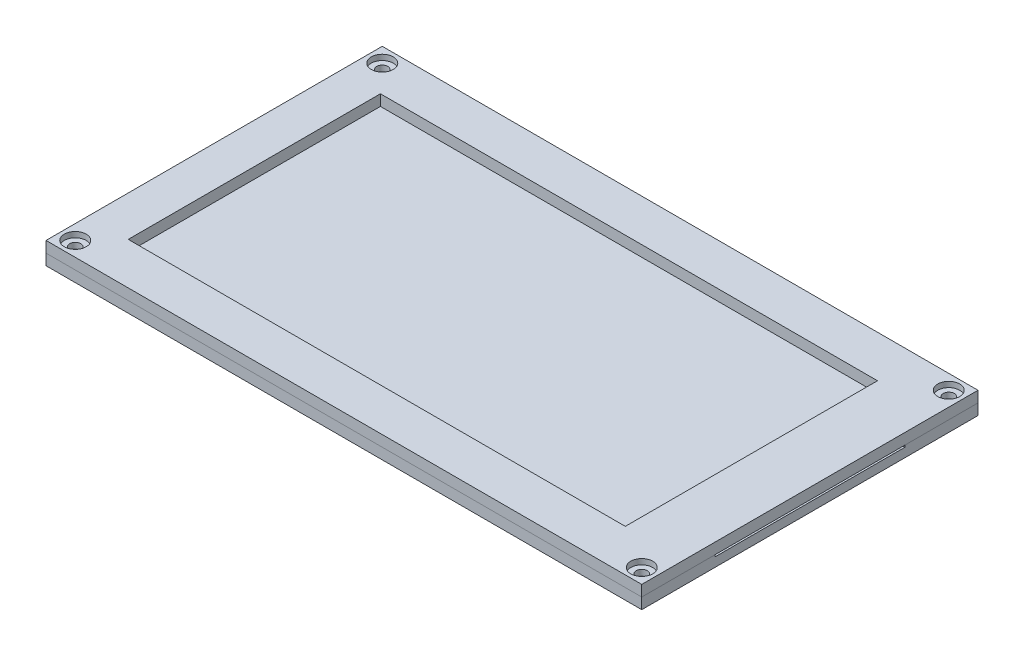
ISO-10303-21;
HEADER;
FILE_DESCRIPTION(('STEP AP214'),'2;1');
FILE_NAME('part.step','',(''),(''),'','','');
FILE_SCHEMA(('AUTOMOTIVE_DESIGN { 1 0 10303 214 1 1 1 1 }'));
ENDSEC;
DATA;
#1=APPLICATION_CONTEXT('core data for automotive mechanical design processes');
#2=APPLICATION_PROTOCOL_DEFINITION('international standard','automotive_design',2000,#1);
#3=PRODUCT_CONTEXT('',#1,'mechanical');
#4=PRODUCT('Part','Part','',(#3));
#5=PRODUCT_RELATED_PRODUCT_CATEGORY('part','',(#4));
#6=PRODUCT_DEFINITION_FORMATION('','',#4);
#7=PRODUCT_DEFINITION_CONTEXT('part definition',#1,'design');
#8=PRODUCT_DEFINITION('design','',#6,#7);
#9=PRODUCT_DEFINITION_SHAPE('','',#8);
#10=(LENGTH_UNIT() NAMED_UNIT(*) SI_UNIT(.MILLI.,.METRE.));
#11=(NAMED_UNIT(*) PLANE_ANGLE_UNIT() SI_UNIT($,.RADIAN.));
#12=(NAMED_UNIT(*) SI_UNIT($,.STERADIAN.) SOLID_ANGLE_UNIT());
#13=UNCERTAINTY_MEASURE_WITH_UNIT(LENGTH_MEASURE(1.E-05),#10,'distance_accuracy_value','');
#14=(GEOMETRIC_REPRESENTATION_CONTEXT(3) GLOBAL_UNCERTAINTY_ASSIGNED_CONTEXT((#13)) GLOBAL_UNIT_ASSIGNED_CONTEXT((#10,
#11,#12)) REPRESENTATION_CONTEXT('',''));
#15=CARTESIAN_POINT('',(0.,0.,0.));
#16=DIRECTION('',(0.,0.,1.));
#17=DIRECTION('',(1.,0.,0.));
#18=AXIS2_PLACEMENT_3D('',#15,#16,#17);
#19=CARTESIAN_POINT('',(0.,-0.5,-26.));
#20=DIRECTION('',(0.,0.,1.));
#21=DIRECTION('',(1.,0.,0.));
#22=AXIS2_PLACEMENT_3D('',#19,#20,#21);
#23=PLANE('',#22);
#24=DIRECTION('',(1.,0.,0.));
#25=VECTOR('',#24,1.);
#26=CARTESIAN_POINT('',(0.,0.,-26.));
#27=LINE('',#26,#25);
#28=CARTESIAN_POINT('',(76.4999999999999,0.,-26.));
#29=VERTEX_POINT('',#28);
#30=CARTESIAN_POINT('',(84.,0.,-26.));
#31=VERTEX_POINT('',#30);
#32=EDGE_CURVE('E172',#29,#31,#27,.T.);
#33=ORIENTED_EDGE('',*,*,#32,.F.);
#34=DIRECTION('',(0.,1.,0.));
#35=VECTOR('',#34,1.);
#36=CARTESIAN_POINT('',(76.4999999999999,-0.5,-26.));
#37=LINE('',#36,#35);
#38=CARTESIAN_POINT('',(76.4999999999999,-0.5,-26.));
#39=VERTEX_POINT('',#38);
#40=EDGE_CURVE('E12',#39,#29,#37,.T.);
#41=ORIENTED_EDGE('',*,*,#40,.F.);
#42=DIRECTION('',(1.,0.,0.));
#43=VECTOR('',#42,1.);
#44=CARTESIAN_POINT('',(0.,-0.5,-26.));
#45=LINE('',#44,#43);
#46=CARTESIAN_POINT('',(84.,-0.5,-26.));
#47=VERTEX_POINT('',#46);
#48=EDGE_CURVE('E223',#39,#47,#45,.T.);
#49=ORIENTED_EDGE('',*,*,#48,.T.);
#50=DIRECTION('',(0.,1.,0.));
#51=VECTOR('',#50,1.);
#52=CARTESIAN_POINT('',(84.,-0.5,-26.));
#53=LINE('',#52,#51);
#54=EDGE_CURVE('E68',#47,#31,#53,.T.);
#55=ORIENTED_EDGE('',*,*,#54,.T.);
#56=EDGE_LOOP('',(#33,#41,#49,#55));
#57=FACE_BOUND('',#56,.T.);
#58=ADVANCED_FACE('F51',(#57),#23,.T.);
#59=CARTESIAN_POINT('',(76.4999999999999,-0.5,0.));
#60=DIRECTION('',(-1.,0.,0.));
#61=DIRECTION('',(0.,0.,1.));
#62=AXIS2_PLACEMENT_3D('',#59,#60,#61);
#63=PLANE('',#62);
#64=DIRECTION('',(0.,0.,1.));
#65=VECTOR('',#64,1.);
#66=CARTESIAN_POINT('',(76.4999999999999,0.,0.));
#67=LINE('',#66,#65);
#68=CARTESIAN_POINT('',(76.4999999999999,0.,-38.5));
#69=VERTEX_POINT('',#68);
#70=EDGE_CURVE('E176',#69,#29,#67,.T.);
#71=ORIENTED_EDGE('',*,*,#70,.F.);
#72=DIRECTION('',(0.,1.,0.));
#73=VECTOR('',#72,1.);
#74=CARTESIAN_POINT('',(76.4999999999999,-0.5,-38.5));
#75=LINE('',#74,#73);
#76=CARTESIAN_POINT('',(76.4999999999999,-0.5,-38.5));
#77=VERTEX_POINT('',#76);
#78=EDGE_CURVE('E60',#77,#69,#75,.T.);
#79=ORIENTED_EDGE('',*,*,#78,.F.);
#80=DIRECTION('',(0.,0.,1.));
#81=VECTOR('',#80,1.);
#82=CARTESIAN_POINT('',(76.4999999999999,-0.5,0.));
#83=LINE('',#82,#81);
#84=EDGE_CURVE('E157',#77,#39,#83,.T.);
#85=ORIENTED_EDGE('',*,*,#84,.T.);
#86=ORIENTED_EDGE('',*,*,#40,.T.);
#87=EDGE_LOOP('',(#71,#79,#85,#86));
#88=FACE_BOUND('',#87,.T.);
#89=ADVANCED_FACE('F258',(#88),#63,.T.);
#90=CARTESIAN_POINT('',(0.,-0.5,-38.5));
#91=DIRECTION('',(0.,0.,1.));
#92=DIRECTION('',(1.,0.,0.));
#93=AXIS2_PLACEMENT_3D('',#90,#91,#92);
#94=PLANE('',#93);
#95=DIRECTION('',(1.,0.,0.));
#96=VECTOR('',#95,1.);
#97=CARTESIAN_POINT('',(0.,0.,-38.5));
#98=LINE('',#97,#96);
#99=CARTESIAN_POINT('',(-71.5,0.,-38.5));
#100=VERTEX_POINT('',#99);
#101=EDGE_CURVE('E181',#100,#69,#98,.T.);
#102=ORIENTED_EDGE('',*,*,#101,.F.);
#103=DIRECTION('',(0.,1.,0.));
#104=VECTOR('',#103,1.);
#105=CARTESIAN_POINT('',(-71.5,-0.5,-38.5));
#106=LINE('',#105,#104);
#107=CARTESIAN_POINT('',(-71.5,-0.5,-38.5));
#108=VERTEX_POINT('',#107);
#109=EDGE_CURVE('E248',#108,#100,#106,.T.);
#110=ORIENTED_EDGE('',*,*,#109,.F.);
#111=DIRECTION('',(1.,0.,0.));
#112=VECTOR('',#111,1.);
#113=CARTESIAN_POINT('',(0.,-0.5,-38.5));
#114=LINE('',#113,#112);
#115=EDGE_CURVE('E166',#108,#77,#114,.T.);
#116=ORIENTED_EDGE('',*,*,#115,.T.);
#117=ORIENTED_EDGE('',*,*,#78,.T.);
#118=EDGE_LOOP('',(#102,#110,#116,#117));
#119=FACE_BOUND('',#118,.T.);
#120=ADVANCED_FACE('F255',(#119),#94,.T.);
#121=CARTESIAN_POINT('',(-71.5,-0.5,0.));
#122=DIRECTION('',(1.,0.,0.));
#123=DIRECTION('',(0.,0.,-1.));
#124=AXIS2_PLACEMENT_3D('',#121,#122,#123);
#125=PLANE('',#124);
#126=DIRECTION('',(0.,0.,-1.));
#127=VECTOR('',#126,1.);
#128=CARTESIAN_POINT('',(-71.5,0.,0.));
#129=LINE('',#128,#127);
#130=CARTESIAN_POINT('',(-71.5,0.,38.5));
#131=VERTEX_POINT('',#130);
#132=EDGE_CURVE('E186',#131,#100,#129,.T.);
#133=ORIENTED_EDGE('',*,*,#132,.F.);
#134=DIRECTION('',(0.,1.,0.));
#135=VECTOR('',#134,1.);
#136=CARTESIAN_POINT('',(-71.5,-0.5,38.5));
#137=LINE('',#136,#135);
#138=CARTESIAN_POINT('',(-71.5,-0.5,38.5));
#139=VERTEX_POINT('',#138);
#140=EDGE_CURVE('E145',#139,#131,#137,.T.);
#141=ORIENTED_EDGE('',*,*,#140,.F.);
#142=DIRECTION('',(0.,0.,-1.));
#143=VECTOR('',#142,1.);
#144=CARTESIAN_POINT('',(-71.5,-0.5,0.));
#145=LINE('',#144,#143);
#146=EDGE_CURVE('E162',#139,#108,#145,.T.);
#147=ORIENTED_EDGE('',*,*,#146,.T.);
#148=ORIENTED_EDGE('',*,*,#109,.T.);
#149=EDGE_LOOP('',(#133,#141,#147,#148));
#150=FACE_BOUND('',#149,.T.);
#151=ADVANCED_FACE('F264',(#150),#125,.T.);
#152=CARTESIAN_POINT('',(0.,-0.5,38.5));
#153=DIRECTION('',(0.,0.,-1.));
#154=DIRECTION('',(-1.,0.,0.));
#155=AXIS2_PLACEMENT_3D('',#152,#153,#154);
#156=PLANE('',#155);
#157=DIRECTION('',(-1.,0.,0.));
#158=VECTOR('',#157,1.);
#159=CARTESIAN_POINT('',(0.,0.,38.5));
#160=LINE('',#159,#158);
#161=CARTESIAN_POINT('',(76.4999999999999,0.,38.5));
#162=VERTEX_POINT('',#161);
#163=EDGE_CURVE('E140',#162,#131,#160,.T.);
#164=ORIENTED_EDGE('',*,*,#163,.F.);
#165=DIRECTION('',(0.,1.,0.));
#166=VECTOR('',#165,1.);
#167=CARTESIAN_POINT('',(76.4999999999999,-0.5,38.5));
#168=LINE('',#167,#166);
#169=CARTESIAN_POINT('',(76.4999999999999,-0.5,38.5));
#170=VERTEX_POINT('',#169);
#171=EDGE_CURVE('E133',#170,#162,#168,.T.);
#172=ORIENTED_EDGE('',*,*,#171,.F.);
#173=DIRECTION('',(-1.,0.,0.));
#174=VECTOR('',#173,1.);
#175=CARTESIAN_POINT('',(0.,-0.5,38.5));
#176=LINE('',#175,#174);
#177=EDGE_CURVE('E137',#170,#139,#176,.T.);
#178=ORIENTED_EDGE('',*,*,#177,.T.);
#179=ORIENTED_EDGE('',*,*,#140,.T.);
#180=EDGE_LOOP('',(#164,#172,#178,#179));
#181=FACE_BOUND('',#180,.T.);
#182=ADVANCED_FACE('F135',(#181),#156,.T.);
#183=CARTESIAN_POINT('',(76.4999999999999,0.,26.));
#184=VERTEX_POINT('',#183);
#185=EDGE_CURVE('E182',#184,#162,#67,.T.);
#186=ORIENTED_EDGE('',*,*,#185,.F.);
#187=DIRECTION('',(0.,1.,0.));
#188=VECTOR('',#187,1.);
#189=CARTESIAN_POINT('',(76.4999999999999,-0.5,26.));
#190=LINE('',#189,#188);
#191=CARTESIAN_POINT('',(76.4999999999999,-0.5,26.));
#192=VERTEX_POINT('',#191);
#193=EDGE_CURVE('E146',#192,#184,#190,.T.);
#194=ORIENTED_EDGE('',*,*,#193,.F.);
#195=EDGE_CURVE('E149',#192,#170,#83,.T.);
#196=ORIENTED_EDGE('',*,*,#195,.T.);
#197=ORIENTED_EDGE('',*,*,#171,.T.);
#198=EDGE_LOOP('',(#186,#194,#196,#197));
#199=FACE_BOUND('',#198,.T.);
#200=ADVANCED_FACE('F150',(#199),#63,.T.);
#201=CARTESIAN_POINT('',(0.,-0.5,26.));
#202=DIRECTION('',(0.,0.,1.));
#203=DIRECTION('',(1.,0.,0.));
#204=AXIS2_PLACEMENT_3D('',#201,#202,#203);
#205=PLANE('',#204);
#206=DIRECTION('',(1.,0.,0.));
#207=VECTOR('',#206,1.);
#208=CARTESIAN_POINT('',(0.,0.,26.));
#209=LINE('',#208,#207);
#210=CARTESIAN_POINT('',(84.,0.,26.));
#211=VERTEX_POINT('',#210);
#212=EDGE_CURVE('E192',#184,#211,#209,.T.);
#213=ORIENTED_EDGE('',*,*,#212,.T.);
#214=DIRECTION('',(0.,1.,0.));
#215=VECTOR('',#214,1.);
#216=CARTESIAN_POINT('',(84.,-0.5,26.));
#217=LINE('',#216,#215);
#218=CARTESIAN_POINT('',(84.,-0.5,26.));
#219=VERTEX_POINT('',#218);
#220=EDGE_CURVE('E240',#219,#211,#217,.T.);
#221=ORIENTED_EDGE('',*,*,#220,.F.);
#222=DIRECTION('',(1.,0.,0.));
#223=VECTOR('',#222,1.);
#224=CARTESIAN_POINT('',(0.,-0.5,26.));
#225=LINE('',#224,#223);
#226=EDGE_CURVE('E155',#192,#219,#225,.T.);
#227=ORIENTED_EDGE('',*,*,#226,.F.);
#228=ORIENTED_EDGE('',*,*,#193,.T.);
#229=EDGE_LOOP('',(#213,#221,#227,#228));
#230=FACE_BOUND('',#229,.T.);
#231=ADVANCED_FACE('F334',(#230),#205,.F.);
#232=CARTESIAN_POINT('',(0.,-0.5,46.));
#233=DIRECTION('',(0.,0.,-1.));
#234=DIRECTION('',(-1.,0.,0.));
#235=AXIS2_PLACEMENT_3D('',#232,#233,#234);
#236=PLANE('',#235);
#237=DIRECTION('',(-1.,0.,0.));
#238=VECTOR('',#237,1.);
#239=CARTESIAN_POINT('',(0.,0.,46.));
#240=LINE('',#239,#238);
#241=CARTESIAN_POINT('',(84.,0.,46.));
#242=VERTEX_POINT('',#241);
#243=CARTESIAN_POINT('',(-79.,0.,46.));
#244=VERTEX_POINT('',#243);
#245=EDGE_CURVE('E198',#242,#244,#240,.T.);
#246=ORIENTED_EDGE('',*,*,#245,.T.);
#247=DIRECTION('',(0.,1.,0.));
#248=VECTOR('',#247,1.);
#249=CARTESIAN_POINT('',(-79.,-0.5,46.));
#250=LINE('',#249,#248);
#251=CARTESIAN_POINT('',(-79.,-3.,46.));
#252=VERTEX_POINT('',#251);
#253=EDGE_CURVE('E232',#252,#244,#250,.T.);
#254=ORIENTED_EDGE('',*,*,#253,.F.);
#255=DIRECTION('',(-1.,0.,0.));
#256=VECTOR('',#255,1.);
#257=CARTESIAN_POINT('',(84.,-3.,46.));
#258=LINE('',#257,#256);
#259=CARTESIAN_POINT('',(84.,-3.,46.));
#260=VERTEX_POINT('',#259);
#261=EDGE_CURVE('E273',#260,#252,#258,.T.);
#262=ORIENTED_EDGE('',*,*,#261,.F.);
#263=DIRECTION('',(0.,1.,0.));
#264=VECTOR('',#263,1.);
#265=CARTESIAN_POINT('',(84.,-0.5,46.));
#266=LINE('',#265,#264);
#267=EDGE_CURVE('E236',#260,#242,#266,.T.);
#268=ORIENTED_EDGE('',*,*,#267,.T.);
#269=EDGE_LOOP('',(#246,#254,#262,#268));
#270=FACE_BOUND('',#269,.T.);
#271=ADVANCED_FACE('F351',(#270),#236,.F.);
#272=CARTESIAN_POINT('',(-79.,-0.5,0.));
#273=DIRECTION('',(1.,0.,0.));
#274=DIRECTION('',(0.,0.,-1.));
#275=AXIS2_PLACEMENT_3D('',#272,#273,#274);
#276=PLANE('',#275);
#277=DIRECTION('',(0.,0.,-1.));
#278=VECTOR('',#277,1.);
#279=CARTESIAN_POINT('',(-79.,0.,0.));
#280=LINE('',#279,#278);
#281=CARTESIAN_POINT('',(-79.,0.,-46.));
#282=VERTEX_POINT('',#281);
#283=EDGE_CURVE('E202',#244,#282,#280,.T.);
#284=ORIENTED_EDGE('',*,*,#283,.T.);
#285=DIRECTION('',(0.,1.,0.));
#286=VECTOR('',#285,1.);
#287=CARTESIAN_POINT('',(-79.,-0.5,-46.));
#288=LINE('',#287,#286);
#289=CARTESIAN_POINT('',(-79.,-3.,-46.));
#290=VERTEX_POINT('',#289);
#291=EDGE_CURVE('E229',#290,#282,#288,.T.);
#292=ORIENTED_EDGE('',*,*,#291,.F.);
#293=DIRECTION('',(0.,0.,-1.));
#294=VECTOR('',#293,1.);
#295=CARTESIAN_POINT('',(-79.,-3.,46.));
#296=LINE('',#295,#294);
#297=EDGE_CURVE('E282',#252,#290,#296,.T.);
#298=ORIENTED_EDGE('',*,*,#297,.F.);
#299=ORIENTED_EDGE('',*,*,#253,.T.);
#300=EDGE_LOOP('',(#284,#292,#298,#299));
#301=FACE_BOUND('',#300,.T.);
#302=ADVANCED_FACE('F353',(#301),#276,.F.);
#303=CARTESIAN_POINT('',(0.,-0.5,-46.));
#304=DIRECTION('',(0.,0.,1.));
#305=DIRECTION('',(1.,0.,0.));
#306=AXIS2_PLACEMENT_3D('',#303,#304,#305);
#307=PLANE('',#306);
#308=DIRECTION('',(1.,0.,0.));
#309=VECTOR('',#308,1.);
#310=CARTESIAN_POINT('',(0.,0.,-46.));
#311=LINE('',#310,#309);
#312=CARTESIAN_POINT('',(84.,0.,-46.));
#313=VERTEX_POINT('',#312);
#314=EDGE_CURVE('E110',#282,#313,#311,.T.);
#315=ORIENTED_EDGE('',*,*,#314,.T.);
#316=DIRECTION('',(0.,1.,0.));
#317=VECTOR('',#316,1.);
#318=CARTESIAN_POINT('',(84.,-0.5,-46.));
#319=LINE('',#318,#317);
#320=CARTESIAN_POINT('',(84.,-3.,-46.));
#321=VERTEX_POINT('',#320);
#322=EDGE_CURVE('E226',#321,#313,#319,.T.);
#323=ORIENTED_EDGE('',*,*,#322,.F.);
#324=DIRECTION('',(1.,0.,0.));
#325=VECTOR('',#324,1.);
#326=CARTESIAN_POINT('',(-79.,-3.,-46.));
#327=LINE('',#326,#325);
#328=EDGE_CURVE('E278',#290,#321,#327,.T.);
#329=ORIENTED_EDGE('',*,*,#328,.F.);
#330=ORIENTED_EDGE('',*,*,#291,.T.);
#331=EDGE_LOOP('',(#315,#323,#329,#330));
#332=FACE_BOUND('',#331,.T.);
#333=ADVANCED_FACE('F357',(#332),#307,.F.);
#334=CARTESIAN_POINT('',(-75.,-0.5,42.));
#335=DIRECTION('',(0.,1.,0.));
#336=DIRECTION('',(0.,0.,1.));
#337=AXIS2_PLACEMENT_3D('',#334,#335,#336);
#338=CYLINDRICAL_SURFACE('',#337,1.5);
#339=CARTESIAN_POINT('',(-75.,0.,42.));
#340=DIRECTION('',(0.,-1.,0.));
#341=DIRECTION('',(0.,0.,-1.));
#342=AXIS2_PLACEMENT_3D('',#339,#340,#341);
#343=CIRCLE('',#342,1.5);
#344=CARTESIAN_POINT('',(-75.,0.,40.5));
#345=VERTEX_POINT('',#344);
#346=EDGE_CURVE('E215',#345,#345,#343,.F.);
#347=ORIENTED_EDGE('',*,*,#346,.T.);
#348=EDGE_LOOP('',(#347));
#349=FACE_BOUND('',#348,.T.);
#350=CARTESIAN_POINT('',(-75.,-3.,42.));
#351=DIRECTION('',(0.,-1.,0.));
#352=DIRECTION('',(0.,0.,-1.));
#353=AXIS2_PLACEMENT_3D('',#350,#351,#352);
#354=CIRCLE('',#353,1.5);
#355=CARTESIAN_POINT('',(-75.,-3.,40.5));
#356=VERTEX_POINT('',#355);
#357=EDGE_CURVE('E274',#356,#356,#354,.T.);
#358=ORIENTED_EDGE('',*,*,#357,.T.);
#359=EDGE_LOOP('',(#358));
#360=FACE_BOUND('',#359,.T.);
#361=ADVANCED_FACE('F359',(#349,#360),#338,.F.);
#362=CARTESIAN_POINT('',(80.,-0.5,42.));
#363=DIRECTION('',(0.,1.,0.));
#364=DIRECTION('',(0.,0.,1.));
#365=AXIS2_PLACEMENT_3D('',#362,#363,#364);
#366=CYLINDRICAL_SURFACE('',#365,1.5);
#367=CARTESIAN_POINT('',(80.,0.,42.));
#368=DIRECTION('',(0.,-1.,0.));
#369=DIRECTION('',(0.,0.,-1.));
#370=AXIS2_PLACEMENT_3D('',#367,#368,#369);
#371=CIRCLE('',#370,1.5);
#372=CARTESIAN_POINT('',(80.,0.,40.5));
#373=VERTEX_POINT('',#372);
#374=EDGE_CURVE('E211',#373,#373,#371,.F.);
#375=ORIENTED_EDGE('',*,*,#374,.T.);
#376=EDGE_LOOP('',(#375));
#377=FACE_BOUND('',#376,.T.);
#378=CARTESIAN_POINT('',(80.,-3.,42.));
#379=DIRECTION('',(0.,-1.,0.));
#380=DIRECTION('',(0.,0.,1.));
#381=AXIS2_PLACEMENT_3D('',#378,#379,#380);
#382=CIRCLE('',#381,1.5);
#383=CARTESIAN_POINT('',(80.,-3.,43.5));
#384=VERTEX_POINT('',#383);
#385=EDGE_CURVE('E292',#384,#384,#382,.T.);
#386=ORIENTED_EDGE('',*,*,#385,.T.);
#387=EDGE_LOOP('',(#386));
#388=FACE_BOUND('',#387,.T.);
#389=ADVANCED_FACE('F365',(#377,#388),#366,.F.);
#390=CARTESIAN_POINT('',(-75.,-0.5,-42.));
#391=DIRECTION('',(0.,1.,0.));
#392=DIRECTION('',(0.,0.,1.));
#393=AXIS2_PLACEMENT_3D('',#390,#391,#392);
#394=CYLINDRICAL_SURFACE('',#393,1.5);
#395=CARTESIAN_POINT('',(-75.,0.,-42.));
#396=DIRECTION('',(0.,-1.,0.));
#397=DIRECTION('',(0.,0.,-1.));
#398=AXIS2_PLACEMENT_3D('',#395,#396,#397);
#399=CIRCLE('',#398,1.5);
#400=CARTESIAN_POINT('',(-75.,0.,-43.5));
#401=VERTEX_POINT('',#400);
#402=EDGE_CURVE('E207',#401,#401,#399,.F.);
#403=ORIENTED_EDGE('',*,*,#402,.T.);
#404=EDGE_LOOP('',(#403));
#405=FACE_BOUND('',#404,.T.);
#406=CARTESIAN_POINT('',(-75.,-3.,-42.));
#407=DIRECTION('',(0.,-1.,0.));
#408=DIRECTION('',(0.,0.,1.));
#409=AXIS2_PLACEMENT_3D('',#406,#407,#408);
#410=CIRCLE('',#409,1.5);
#411=CARTESIAN_POINT('',(-75.,-3.,-40.5));
#412=VERTEX_POINT('',#411);
#413=EDGE_CURVE('E300',#412,#412,#410,.T.);
#414=ORIENTED_EDGE('',*,*,#413,.T.);
#415=EDGE_LOOP('',(#414));
#416=FACE_BOUND('',#415,.T.);
#417=ADVANCED_FACE('F305',(#405,#416),#394,.F.);
#418=CARTESIAN_POINT('',(84.,-0.5,0.));
#419=DIRECTION('',(-1.,0.,0.));
#420=DIRECTION('',(0.,0.,1.));
#421=AXIS2_PLACEMENT_3D('',#418,#419,#420);
#422=PLANE('',#421);
#423=DIRECTION('',(0.,0.,1.));
#424=VECTOR('',#423,1.);
#425=CARTESIAN_POINT('',(84.,0.,0.));
#426=LINE('',#425,#424);
#427=EDGE_CURVE('E199',#313,#31,#426,.T.);
#428=ORIENTED_EDGE('',*,*,#427,.T.);
#429=ORIENTED_EDGE('',*,*,#54,.F.);
#430=DIRECTION('',(0.,0.,1.));
#431=VECTOR('',#430,1.);
#432=CARTESIAN_POINT('',(84.,-0.5,-46.));
#433=LINE('',#432,#431);
#434=EDGE_CURVE('E270',#47,#219,#433,.T.);
#435=ORIENTED_EDGE('',*,*,#434,.T.);
#436=ORIENTED_EDGE('',*,*,#220,.T.);
#437=EDGE_CURVE('E195',#211,#242,#426,.T.);
#438=ORIENTED_EDGE('',*,*,#437,.T.);
#439=ORIENTED_EDGE('',*,*,#267,.F.);
#440=DIRECTION('',(0.,0.,1.));
#441=VECTOR('',#440,1.);
#442=CARTESIAN_POINT('',(84.,-3.,-46.));
#443=LINE('',#442,#441);
#444=EDGE_CURVE('E177',#321,#260,#443,.T.);
#445=ORIENTED_EDGE('',*,*,#444,.F.);
#446=ORIENTED_EDGE('',*,*,#322,.T.);
#447=EDGE_LOOP('',(#428,#429,#435,#436,#438,#439,#445,#446));
#448=FACE_BOUND('',#447,.T.);
#449=ADVANCED_FACE('F335',(#448),#422,.F.);
#450=CARTESIAN_POINT('',(80.,-0.5,-42.));
#451=DIRECTION('',(0.,1.,0.));
#452=DIRECTION('',(0.,0.,1.));
#453=AXIS2_PLACEMENT_3D('',#450,#451,#452);
#454=CYLINDRICAL_SURFACE('',#453,1.5);
#455=CARTESIAN_POINT('',(80.,0.,-42.));
#456=DIRECTION('',(0.,-1.,0.));
#457=DIRECTION('',(0.,0.,-1.));
#458=AXIS2_PLACEMENT_3D('',#455,#456,#457);
#459=CIRCLE('',#458,1.5);
#460=CARTESIAN_POINT('',(80.,0.,-43.5));
#461=VERTEX_POINT('',#460);
#462=EDGE_CURVE('E219',#461,#461,#459,.F.);
#463=ORIENTED_EDGE('',*,*,#462,.T.);
#464=EDGE_LOOP('',(#463));
#465=FACE_BOUND('',#464,.T.);
#466=CARTESIAN_POINT('',(80.,-3.,-42.));
#467=DIRECTION('',(0.,-1.,0.));
#468=DIRECTION('',(0.,0.,-1.));
#469=AXIS2_PLACEMENT_3D('',#466,#467,#468);
#470=CIRCLE('',#469,1.5);
#471=CARTESIAN_POINT('',(80.,-3.,-43.5));
#472=VERTEX_POINT('',#471);
#473=EDGE_CURVE('E296',#472,#472,#470,.T.);
#474=ORIENTED_EDGE('',*,*,#473,.T.);
#475=EDGE_LOOP('',(#474));
#476=FACE_BOUND('',#475,.T.);
#477=ADVANCED_FACE('F316',(#465,#476),#454,.F.);
#478=CARTESIAN_POINT('',(0.,0.,0.));
#479=DIRECTION('',(0.,-1.,0.));
#480=DIRECTION('',(0.,0.,-1.));
#481=AXIS2_PLACEMENT_3D('',#478,#479,#480);
#482=PLANE('',#481);
#483=ORIENTED_EDGE('',*,*,#32,.T.);
#484=ORIENTED_EDGE('',*,*,#427,.F.);
#485=ORIENTED_EDGE('',*,*,#314,.F.);
#486=ORIENTED_EDGE('',*,*,#283,.F.);
#487=ORIENTED_EDGE('',*,*,#245,.F.);
#488=ORIENTED_EDGE('',*,*,#437,.F.);
#489=ORIENTED_EDGE('',*,*,#212,.F.);
#490=ORIENTED_EDGE('',*,*,#185,.T.);
#491=ORIENTED_EDGE('',*,*,#163,.T.);
#492=ORIENTED_EDGE('',*,*,#132,.T.);
#493=ORIENTED_EDGE('',*,*,#101,.T.);
#494=ORIENTED_EDGE('',*,*,#70,.T.);
#495=EDGE_LOOP('',(#483,#484,#485,#486,#487,#488,#489,#490,#491,#492,#493,#494));
#496=FACE_BOUND('',#495,.T.);
#497=ORIENTED_EDGE('',*,*,#402,.F.);
#498=EDGE_LOOP('',(#497));
#499=FACE_BOUND('',#498,.T.);
#500=ORIENTED_EDGE('',*,*,#374,.F.);
#501=EDGE_LOOP('',(#500));
#502=FACE_BOUND('',#501,.T.);
#503=ORIENTED_EDGE('',*,*,#346,.F.);
#504=EDGE_LOOP('',(#503));
#505=FACE_BOUND('',#504,.T.);
#506=ORIENTED_EDGE('',*,*,#462,.F.);
#507=EDGE_LOOP('',(#506));
#508=FACE_BOUND('',#507,.T.);
#509=ADVANCED_FACE('F260',(#496,#499,#502,#505,#508),#482,.F.);
#510=CARTESIAN_POINT('',(0.,-3.,0.));
#511=DIRECTION('',(0.,-1.,0.));
#512=DIRECTION('',(0.,0.,-1.));
#513=AXIS2_PLACEMENT_3D('',#510,#511,#512);
#514=PLANE('',#513);
#515=ORIENTED_EDGE('',*,*,#473,.F.);
#516=EDGE_LOOP('',(#515));
#517=FACE_BOUND('',#516,.T.);
#518=ORIENTED_EDGE('',*,*,#357,.F.);
#519=EDGE_LOOP('',(#518));
#520=FACE_BOUND('',#519,.T.);
#521=ORIENTED_EDGE('',*,*,#261,.T.);
#522=ORIENTED_EDGE('',*,*,#297,.T.);
#523=ORIENTED_EDGE('',*,*,#328,.T.);
#524=ORIENTED_EDGE('',*,*,#444,.T.);
#525=EDGE_LOOP('',(#521,#522,#523,#524));
#526=FACE_BOUND('',#525,.T.);
#527=ORIENTED_EDGE('',*,*,#385,.F.);
#528=EDGE_LOOP('',(#527));
#529=FACE_BOUND('',#528,.T.);
#530=ORIENTED_EDGE('',*,*,#413,.F.);
#531=EDGE_LOOP('',(#530));
#532=FACE_BOUND('',#531,.T.);
#533=ADVANCED_FACE('F307',(#517,#520,#526,#529,#532),#514,.T.);
#534=CARTESIAN_POINT('',(0.,-0.5,0.));
#535=DIRECTION('',(0.,-1.,0.));
#536=DIRECTION('',(0.,0.,-1.));
#537=AXIS2_PLACEMENT_3D('',#534,#535,#536);
#538=PLANE('',#537);
#539=ORIENTED_EDGE('',*,*,#48,.F.);
#540=ORIENTED_EDGE('',*,*,#84,.F.);
#541=ORIENTED_EDGE('',*,*,#115,.F.);
#542=ORIENTED_EDGE('',*,*,#146,.F.);
#543=ORIENTED_EDGE('',*,*,#177,.F.);
#544=ORIENTED_EDGE('',*,*,#195,.F.);
#545=ORIENTED_EDGE('',*,*,#226,.T.);
#546=ORIENTED_EDGE('',*,*,#434,.F.);
#547=EDGE_LOOP('',(#539,#540,#541,#542,#543,#544,#545,#546));
#548=FACE_BOUND('',#547,.T.);
#549=ADVANCED_FACE('F159',(#548),#538,.F.);
#550=CLOSED_SHELL('',(#58,#89,#120,#151,#182,#200,#231,#271,#302,#333,#361,#389,#417,#449,#477,
#509,#533,#549));
#551=MANIFOLD_SOLID_BREP('B2',#550);
#552=CARTESIAN_POINT('',(-75.,3.,-42.));
#553=DIRECTION('',(0.,-1.,0.));
#554=DIRECTION('',(0.,0.,-1.));
#555=AXIS2_PLACEMENT_3D('',#552,#553,#554);
#556=CYLINDRICAL_SURFACE('',#555,1.5);
#557=CARTESIAN_POINT('',(-75.,0.,-42.));
#558=DIRECTION('',(0.,1.,0.));
#559=DIRECTION('',(0.,0.,1.));
#560=AXIS2_PLACEMENT_3D('',#557,#558,#559);
#561=CIRCLE('',#560,1.5);
#562=CARTESIAN_POINT('',(-75.,0.,-40.5));
#563=VERTEX_POINT('',#562);
#564=EDGE_CURVE('E657',#563,#563,#561,.T.);
#565=ORIENTED_EDGE('',*,*,#564,.F.);
#566=EDGE_LOOP('',(#565));
#567=FACE_BOUND('',#566,.T.);
#568=CARTESIAN_POINT('',(-75.,1.5,-42.));
#569=DIRECTION('',(0.,1.,0.));
#570=DIRECTION('',(0.,0.,1.));
#571=AXIS2_PLACEMENT_3D('',#568,#569,#570);
#572=CIRCLE('',#571,1.5);
#573=CARTESIAN_POINT('',(-75.,1.5,-40.5));
#574=VERTEX_POINT('',#573);
#575=EDGE_CURVE('E565',#574,#574,#572,.T.);
#576=ORIENTED_EDGE('',*,*,#575,.T.);
#577=EDGE_LOOP('',(#576));
#578=FACE_BOUND('',#577,.T.);
#579=ADVANCED_FACE('F561',(#567,#578),#556,.F.);
#580=CARTESIAN_POINT('',(80.,3.,42.));
#581=DIRECTION('',(0.,-1.,0.));
#582=DIRECTION('',(0.,0.,-1.));
#583=AXIS2_PLACEMENT_3D('',#580,#581,#582);
#584=CYLINDRICAL_SURFACE('',#583,1.5);
#585=CARTESIAN_POINT('',(80.,0.,42.));
#586=DIRECTION('',(0.,1.,0.));
#587=DIRECTION('',(0.,0.,1.));
#588=AXIS2_PLACEMENT_3D('',#585,#586,#587);
#589=CIRCLE('',#588,1.5);
#590=CARTESIAN_POINT('',(80.,0.,43.5));
#591=VERTEX_POINT('',#590);
#592=EDGE_CURVE('E707',#591,#591,#589,.T.);
#593=ORIENTED_EDGE('',*,*,#592,.F.);
#594=EDGE_LOOP('',(#593));
#595=FACE_BOUND('',#594,.T.);
#596=CARTESIAN_POINT('',(80.,1.5,42.));
#597=DIRECTION('',(0.,1.,0.));
#598=DIRECTION('',(0.,0.,1.));
#599=AXIS2_PLACEMENT_3D('',#596,#597,#598);
#600=CIRCLE('',#599,1.5);
#601=CARTESIAN_POINT('',(80.,1.5,43.5));
#602=VERTEX_POINT('',#601);
#603=EDGE_CURVE('E695',#602,#602,#600,.T.);
#604=ORIENTED_EDGE('',*,*,#603,.T.);
#605=EDGE_LOOP('',(#604));
#606=FACE_BOUND('',#605,.T.);
#607=ADVANCED_FACE('F726',(#595,#606),#584,.F.);
#608=CARTESIAN_POINT('',(0.,3.,0.));
#609=DIRECTION('',(0.,1.,0.));
#610=DIRECTION('',(0.,0.,1.));
#611=AXIS2_PLACEMENT_3D('',#608,#609,#610);
#612=PLANE('',#611);
#613=CARTESIAN_POINT('',(-75.,3.,42.));
#614=DIRECTION('',(0.,1.,0.));
#615=DIRECTION('',(0.,0.,-1.));
#616=AXIS2_PLACEMENT_3D('',#613,#614,#615);
#617=CIRCLE('',#616,3.00000000000001);
#618=CARTESIAN_POINT('',(-75.,3.,39.));
#619=VERTEX_POINT('',#618);
#620=EDGE_CURVE('E947',#619,#619,#617,.T.);
#621=ORIENTED_EDGE('',*,*,#620,.F.);
#622=EDGE_LOOP('',(#621));
#623=FACE_BOUND('',#622,.T.);
#624=CARTESIAN_POINT('',(80.,3.,42.));
#625=DIRECTION('',(0.,1.,0.));
#626=DIRECTION('',(0.,0.,1.));
#627=AXIS2_PLACEMENT_3D('',#624,#625,#626);
#628=CIRCLE('',#627,3.00000000000001);
#629=CARTESIAN_POINT('',(80.,3.,45.));
#630=VERTEX_POINT('',#629);
#631=EDGE_CURVE('E953',#630,#630,#628,.T.);
#632=ORIENTED_EDGE('',*,*,#631,.F.);
#633=EDGE_LOOP('',(#632));
#634=FACE_BOUND('',#633,.T.);
#635=CARTESIAN_POINT('',(80.,3.,-42.));
#636=DIRECTION('',(0.,1.,0.));
#637=DIRECTION('',(0.,0.,-1.));
#638=AXIS2_PLACEMENT_3D('',#635,#636,#637);
#639=CIRCLE('',#638,3.00000000000001);
#640=CARTESIAN_POINT('',(80.,3.,-45.));
#641=VERTEX_POINT('',#640);
#642=EDGE_CURVE('E959',#641,#641,#639,.T.);
#643=ORIENTED_EDGE('',*,*,#642,.F.);
#644=EDGE_LOOP('',(#643));
#645=FACE_BOUND('',#644,.T.);
#646=CARTESIAN_POINT('',(-75.,3.,-42.));
#647=DIRECTION('',(0.,1.,0.));
#648=DIRECTION('',(0.,0.,1.));
#649=AXIS2_PLACEMENT_3D('',#646,#647,#648);
#650=CIRCLE('',#649,3.00000000000001);
#651=CARTESIAN_POINT('',(-75.,3.,-39.));
#652=VERTEX_POINT('',#651);
#653=EDGE_CURVE('E715',#652,#652,#650,.T.);
#654=ORIENTED_EDGE('',*,*,#653,.F.);
#655=EDGE_LOOP('',(#654));
#656=FACE_BOUND('',#655,.T.);
#657=DIRECTION('',(-1.,0.,0.));
#658=VECTOR('',#657,1.);
#659=CARTESIAN_POINT('',(83.9999999999999,3.,-46.));
#660=LINE('',#659,#658);
#661=CARTESIAN_POINT('',(83.9999999999999,3.,-46.));
#662=VERTEX_POINT('',#661);
#663=CARTESIAN_POINT('',(-79.,3.,-46.));
#664=VERTEX_POINT('',#663);
#665=EDGE_CURVE('E667',#662,#664,#660,.T.);
#666=ORIENTED_EDGE('',*,*,#665,.T.);
#667=DIRECTION('',(0.,0.,1.));
#668=VECTOR('',#667,1.);
#669=CARTESIAN_POINT('',(-79.,3.,-46.));
#670=LINE('',#669,#668);
#671=CARTESIAN_POINT('',(-79.,3.,46.));
#672=VERTEX_POINT('',#671);
#673=EDGE_CURVE('E670',#664,#672,#670,.T.);
#674=ORIENTED_EDGE('',*,*,#673,.T.);
#675=DIRECTION('',(1.,0.,0.));
#676=VECTOR('',#675,1.);
#677=CARTESIAN_POINT('',(-79.,3.,46.));
#678=LINE('',#677,#676);
#679=CARTESIAN_POINT('',(84.,3.,46.));
#680=VERTEX_POINT('',#679);
#681=EDGE_CURVE('E673',#672,#680,#678,.T.);
#682=ORIENTED_EDGE('',*,*,#681,.T.);
#683=DIRECTION('',(0.,0.,-1.));
#684=VECTOR('',#683,1.);
#685=CARTESIAN_POINT('',(84.,3.,46.));
#686=LINE('',#685,#684);
#687=EDGE_CURVE('E675',#680,#662,#686,.T.);
#688=ORIENTED_EDGE('',*,*,#687,.T.);
#689=EDGE_LOOP('',(#666,#674,#682,#688));
#690=FACE_BOUND('',#689,.T.);
#691=DIRECTION('',(-1.,0.,0.));
#692=VECTOR('',#691,1.);
#693=CARTESIAN_POINT('',(-68.,3.,-34.5));
#694=LINE('',#693,#692);
#695=CARTESIAN_POINT('',(68.,3.,-34.5));
#696=VERTEX_POINT('',#695);
#697=CARTESIAN_POINT('',(-68.,3.,-34.5));
#698=VERTEX_POINT('',#697);
#699=EDGE_CURVE('E636',#696,#698,#694,.T.);
#700=ORIENTED_EDGE('',*,*,#699,.F.);
#701=DIRECTION('',(0.,0.,-1.));
#702=VECTOR('',#701,1.);
#703=CARTESIAN_POINT('',(68.,3.,-34.5));
#704=LINE('',#703,#702);
#705=CARTESIAN_POINT('',(68.,3.,34.5));
#706=VERTEX_POINT('',#705);
#707=EDGE_CURVE('E628',#706,#696,#704,.T.);
#708=ORIENTED_EDGE('',*,*,#707,.F.);
#709=DIRECTION('',(1.,0.,0.));
#710=VECTOR('',#709,1.);
#711=CARTESIAN_POINT('',(-68.,3.,34.5));
#712=LINE('',#711,#710);
#713=CARTESIAN_POINT('',(-68.,3.,34.5));
#714=VERTEX_POINT('',#713);
#715=EDGE_CURVE('E651',#714,#706,#712,.T.);
#716=ORIENTED_EDGE('',*,*,#715,.F.);
#717=DIRECTION('',(0.,0.,1.));
#718=VECTOR('',#717,1.);
#719=CARTESIAN_POINT('',(-68.,3.,-34.5));
#720=LINE('',#719,#718);
#721=EDGE_CURVE('E649',#698,#714,#720,.T.);
#722=ORIENTED_EDGE('',*,*,#721,.F.);
#723=EDGE_LOOP('',(#700,#708,#716,#722));
#724=FACE_BOUND('',#723,.T.);
#725=ADVANCED_FACE('F648',(#623,#634,#645,#656,#690,#724),#612,.T.);
#726=CARTESIAN_POINT('',(0.,0.,0.));
#727=DIRECTION('',(0.,1.,0.));
#728=DIRECTION('',(0.,0.,1.));
#729=AXIS2_PLACEMENT_3D('',#726,#727,#728);
#730=PLANE('',#729);
#731=DIRECTION('',(-1.,0.,0.));
#732=VECTOR('',#731,1.);
#733=CARTESIAN_POINT('',(83.9999999999999,0.,-46.));
#734=LINE('',#733,#732);
#735=CARTESIAN_POINT('',(83.9999999999999,0.,-46.));
#736=VERTEX_POINT('',#735);
#737=CARTESIAN_POINT('',(-79.,0.,-46.));
#738=VERTEX_POINT('',#737);
#739=EDGE_CURVE('E644',#736,#738,#734,.T.);
#740=ORIENTED_EDGE('',*,*,#739,.F.);
#741=DIRECTION('',(0.,0.,-1.));
#742=VECTOR('',#741,1.);
#743=CARTESIAN_POINT('',(84.,0.,46.));
#744=LINE('',#743,#742);
#745=CARTESIAN_POINT('',(84.,0.,46.));
#746=VERTEX_POINT('',#745);
#747=EDGE_CURVE('E671',#746,#736,#744,.T.);
#748=ORIENTED_EDGE('',*,*,#747,.F.);
#749=DIRECTION('',(1.,0.,0.));
#750=VECTOR('',#749,1.);
#751=CARTESIAN_POINT('',(-79.,0.,46.));
#752=LINE('',#751,#750);
#753=CARTESIAN_POINT('',(-79.,0.,46.));
#754=VERTEX_POINT('',#753);
#755=EDGE_CURVE('E682',#754,#746,#752,.T.);
#756=ORIENTED_EDGE('',*,*,#755,.F.);
#757=DIRECTION('',(0.,0.,1.));
#758=VECTOR('',#757,1.);
#759=CARTESIAN_POINT('',(-79.,0.,-46.));
#760=LINE('',#759,#758);
#761=EDGE_CURVE('E680',#738,#754,#760,.T.);
#762=ORIENTED_EDGE('',*,*,#761,.F.);
#763=EDGE_LOOP('',(#740,#748,#756,#762));
#764=FACE_BOUND('',#763,.T.);
#765=DIRECTION('',(0.,0.,-1.));
#766=VECTOR('',#765,1.);
#767=CARTESIAN_POINT('',(68.,0.,-34.5));
#768=LINE('',#767,#766);
#769=CARTESIAN_POINT('',(68.,0.,34.5));
#770=VERTEX_POINT('',#769);
#771=CARTESIAN_POINT('',(68.,0.,-34.5));
#772=VERTEX_POINT('',#771);
#773=EDGE_CURVE('E586',#770,#772,#768,.T.);
#774=ORIENTED_EDGE('',*,*,#773,.T.);
#775=DIRECTION('',(-1.,0.,0.));
#776=VECTOR('',#775,1.);
#777=CARTESIAN_POINT('',(-68.,0.,-34.5));
#778=LINE('',#777,#776);
#779=CARTESIAN_POINT('',(-68.,0.,-34.5));
#780=VERTEX_POINT('',#779);
#781=EDGE_CURVE('E643',#772,#780,#778,.T.);
#782=ORIENTED_EDGE('',*,*,#781,.T.);
#783=DIRECTION('',(0.,0.,1.));
#784=VECTOR('',#783,1.);
#785=CARTESIAN_POINT('',(-68.,0.,-34.5));
#786=LINE('',#785,#784);
#787=CARTESIAN_POINT('',(-68.,0.,34.5));
#788=VERTEX_POINT('',#787);
#789=EDGE_CURVE('E659',#780,#788,#786,.T.);
#790=ORIENTED_EDGE('',*,*,#789,.T.);
#791=DIRECTION('',(1.,0.,0.));
#792=VECTOR('',#791,1.);
#793=CARTESIAN_POINT('',(-68.,0.,34.5));
#794=LINE('',#793,#792);
#795=EDGE_CURVE('E637',#788,#770,#794,.T.);
#796=ORIENTED_EDGE('',*,*,#795,.T.);
#797=EDGE_LOOP('',(#774,#782,#790,#796));
#798=FACE_BOUND('',#797,.T.);
#799=ORIENTED_EDGE('',*,*,#564,.T.);
#800=EDGE_LOOP('',(#799));
#801=FACE_BOUND('',#800,.T.);
#802=CARTESIAN_POINT('',(80.,0.,-42.));
#803=DIRECTION('',(0.,1.,0.));
#804=DIRECTION('',(0.,0.,-1.));
#805=AXIS2_PLACEMENT_3D('',#802,#803,#804);
#806=CIRCLE('',#805,1.5);
#807=CARTESIAN_POINT('',(80.,0.,-43.5));
#808=VERTEX_POINT('',#807);
#809=EDGE_CURVE('E712',#808,#808,#806,.T.);
#810=ORIENTED_EDGE('',*,*,#809,.T.);
#811=EDGE_LOOP('',(#810));
#812=FACE_BOUND('',#811,.T.);
#813=ORIENTED_EDGE('',*,*,#592,.T.);
#814=EDGE_LOOP('',(#813));
#815=FACE_BOUND('',#814,.T.);
#816=CARTESIAN_POINT('',(-75.,0.,42.));
#817=DIRECTION('',(0.,1.,0.));
#818=DIRECTION('',(0.,0.,-1.));
#819=AXIS2_PLACEMENT_3D('',#816,#817,#818);
#820=CIRCLE('',#819,1.5);
#821=CARTESIAN_POINT('',(-75.,0.,40.5));
#822=VERTEX_POINT('',#821);
#823=EDGE_CURVE('E703',#822,#822,#820,.T.);
#824=ORIENTED_EDGE('',*,*,#823,.T.);
#825=EDGE_LOOP('',(#824));
#826=FACE_BOUND('',#825,.T.);
#827=ADVANCED_FACE('F722',(#764,#798,#801,#812,#815,#826),#730,.F.);
#828=CARTESIAN_POINT('',(83.9999999999999,3.,-46.));
#829=DIRECTION('',(0.,0.,1.));
#830=DIRECTION('',(1.,0.,0.));
#831=AXIS2_PLACEMENT_3D('',#828,#829,#830);
#832=PLANE('',#831);
#833=ORIENTED_EDGE('',*,*,#739,.T.);
#834=DIRECTION('',(0.,-1.,0.));
#835=VECTOR('',#834,1.);
#836=CARTESIAN_POINT('',(-79.,3.,-46.));
#837=LINE('',#836,#835);
#838=EDGE_CURVE('E49',#664,#738,#837,.T.);
#839=ORIENTED_EDGE('',*,*,#838,.F.);
#840=ORIENTED_EDGE('',*,*,#665,.F.);
#841=DIRECTION('',(0.,-1.,0.));
#842=VECTOR('',#841,1.);
#843=CARTESIAN_POINT('',(83.9999999999999,3.,-46.));
#844=LINE('',#843,#842);
#845=EDGE_CURVE('E677',#662,#736,#844,.T.);
#846=ORIENTED_EDGE('',*,*,#845,.T.);
#847=EDGE_LOOP('',(#833,#839,#840,#846));
#848=FACE_BOUND('',#847,.T.);
#849=ADVANCED_FACE('F563',(#848),#832,.F.);
#850=CARTESIAN_POINT('',(-79.,3.,-46.));
#851=DIRECTION('',(1.,0.,0.));
#852=DIRECTION('',(0.,0.,-1.));
#853=AXIS2_PLACEMENT_3D('',#850,#851,#852);
#854=PLANE('',#853);
#855=ORIENTED_EDGE('',*,*,#761,.T.);
#856=DIRECTION('',(0.,-1.,0.));
#857=VECTOR('',#856,1.);
#858=CARTESIAN_POINT('',(-79.,3.,46.));
#859=LINE('',#858,#857);
#860=EDGE_CURVE('E570',#672,#754,#859,.T.);
#861=ORIENTED_EDGE('',*,*,#860,.F.);
#862=ORIENTED_EDGE('',*,*,#673,.F.);
#863=ORIENTED_EDGE('',*,*,#838,.T.);
#864=EDGE_LOOP('',(#855,#861,#862,#863));
#865=FACE_BOUND('',#864,.T.);
#866=ADVANCED_FACE('F759',(#865),#854,.F.);
#867=CARTESIAN_POINT('',(-79.,3.,46.));
#868=DIRECTION('',(0.,0.,-1.));
#869=DIRECTION('',(-1.,0.,0.));
#870=AXIS2_PLACEMENT_3D('',#867,#868,#869);
#871=PLANE('',#870);
#872=ORIENTED_EDGE('',*,*,#755,.T.);
#873=DIRECTION('',(0.,-1.,0.));
#874=VECTOR('',#873,1.);
#875=CARTESIAN_POINT('',(84.,3.,46.));
#876=LINE('',#875,#874);
#877=EDGE_CURVE('E687',#680,#746,#876,.T.);
#878=ORIENTED_EDGE('',*,*,#877,.F.);
#879=ORIENTED_EDGE('',*,*,#681,.F.);
#880=ORIENTED_EDGE('',*,*,#860,.T.);
#881=EDGE_LOOP('',(#872,#878,#879,#880));
#882=FACE_BOUND('',#881,.T.);
#883=ADVANCED_FACE('F756',(#882),#871,.F.);
#884=CARTESIAN_POINT('',(84.,3.,46.));
#885=DIRECTION('',(-1.,0.,0.));
#886=DIRECTION('',(0.,0.,1.));
#887=AXIS2_PLACEMENT_3D('',#884,#885,#886);
#888=PLANE('',#887);
#889=ORIENTED_EDGE('',*,*,#747,.T.);
#890=ORIENTED_EDGE('',*,*,#845,.F.);
#891=ORIENTED_EDGE('',*,*,#687,.F.);
#892=ORIENTED_EDGE('',*,*,#877,.T.);
#893=EDGE_LOOP('',(#889,#890,#891,#892));
#894=FACE_BOUND('',#893,.T.);
#895=ADVANCED_FACE('F747',(#894),#888,.F.);
#896=CARTESIAN_POINT('',(68.,3.,-34.5));
#897=DIRECTION('',(-1.,0.,0.));
#898=DIRECTION('',(0.,0.,1.));
#899=AXIS2_PLACEMENT_3D('',#896,#897,#898);
#900=PLANE('',#899);
#901=ORIENTED_EDGE('',*,*,#773,.F.);
#902=DIRECTION('',(0.,-1.,0.));
#903=VECTOR('',#902,1.);
#904=CARTESIAN_POINT('',(68.,3.,34.5));
#905=LINE('',#904,#903);
#906=EDGE_CURVE('E632',#706,#770,#905,.T.);
#907=ORIENTED_EDGE('',*,*,#906,.F.);
#908=ORIENTED_EDGE('',*,*,#707,.T.);
#909=DIRECTION('',(0.,-1.,0.));
#910=VECTOR('',#909,1.);
#911=CARTESIAN_POINT('',(68.,3.,-34.5));
#912=LINE('',#911,#910);
#913=EDGE_CURVE('E631',#696,#772,#912,.T.);
#914=ORIENTED_EDGE('',*,*,#913,.T.);
#915=EDGE_LOOP('',(#901,#907,#908,#914));
#916=FACE_BOUND('',#915,.T.);
#917=ADVANCED_FACE('F630',(#916),#900,.T.);
#918=CARTESIAN_POINT('',(-68.,3.,-34.5));
#919=DIRECTION('',(0.,0.,1.));
#920=DIRECTION('',(1.,0.,0.));
#921=AXIS2_PLACEMENT_3D('',#918,#919,#920);
#922=PLANE('',#921);
#923=ORIENTED_EDGE('',*,*,#781,.F.);
#924=ORIENTED_EDGE('',*,*,#913,.F.);
#925=ORIENTED_EDGE('',*,*,#699,.T.);
#926=DIRECTION('',(0.,-1.,0.));
#927=VECTOR('',#926,1.);
#928=CARTESIAN_POINT('',(-68.,3.,-34.5));
#929=LINE('',#928,#927);
#930=EDGE_CURVE('E645',#698,#780,#929,.T.);
#931=ORIENTED_EDGE('',*,*,#930,.T.);
#932=EDGE_LOOP('',(#923,#924,#925,#931));
#933=FACE_BOUND('',#932,.T.);
#934=ADVANCED_FACE('F640',(#933),#922,.T.);
#935=CARTESIAN_POINT('',(-68.,3.,-34.5));
#936=DIRECTION('',(1.,0.,0.));
#937=DIRECTION('',(0.,0.,-1.));
#938=AXIS2_PLACEMENT_3D('',#935,#936,#937);
#939=PLANE('',#938);
#940=ORIENTED_EDGE('',*,*,#789,.F.);
#941=ORIENTED_EDGE('',*,*,#930,.F.);
#942=ORIENTED_EDGE('',*,*,#721,.T.);
#943=DIRECTION('',(0.,-1.,0.));
#944=VECTOR('',#943,1.);
#945=CARTESIAN_POINT('',(-68.,3.,34.5));
#946=LINE('',#945,#944);
#947=EDGE_CURVE('E578',#714,#788,#946,.T.);
#948=ORIENTED_EDGE('',*,*,#947,.T.);
#949=EDGE_LOOP('',(#940,#941,#942,#948));
#950=FACE_BOUND('',#949,.T.);
#951=ADVANCED_FACE('F739',(#950),#939,.T.);
#952=CARTESIAN_POINT('',(-68.,3.,34.5));
#953=DIRECTION('',(0.,0.,-1.));
#954=DIRECTION('',(-1.,0.,0.));
#955=AXIS2_PLACEMENT_3D('',#952,#953,#954);
#956=PLANE('',#955);
#957=ORIENTED_EDGE('',*,*,#795,.F.);
#958=ORIENTED_EDGE('',*,*,#947,.F.);
#959=ORIENTED_EDGE('',*,*,#715,.T.);
#960=ORIENTED_EDGE('',*,*,#906,.T.);
#961=EDGE_LOOP('',(#957,#958,#959,#960));
#962=FACE_BOUND('',#961,.T.);
#963=ADVANCED_FACE('F736',(#962),#956,.T.);
#964=CARTESIAN_POINT('',(80.,3.,-42.));
#965=DIRECTION('',(0.,-1.,0.));
#966=DIRECTION('',(0.,0.,-1.));
#967=AXIS2_PLACEMENT_3D('',#964,#965,#966);
#968=CYLINDRICAL_SURFACE('',#967,1.5);
#969=CARTESIAN_POINT('',(80.,1.5,-42.));
#970=DIRECTION('',(0.,-1.,0.));
#971=DIRECTION('',(0.,0.,-1.));
#972=AXIS2_PLACEMENT_3D('',#969,#970,#971);
#973=CIRCLE('',#972,1.5);
#974=CARTESIAN_POINT('',(80.,1.5,-43.5));
#975=VERTEX_POINT('',#974);
#976=EDGE_CURVE('E698',#975,#975,#973,.T.);
#977=ORIENTED_EDGE('',*,*,#976,.F.);
#978=EDGE_LOOP('',(#977));
#979=FACE_BOUND('',#978,.T.);
#980=ORIENTED_EDGE('',*,*,#809,.F.);
#981=EDGE_LOOP('',(#980));
#982=FACE_BOUND('',#981,.T.);
#983=ADVANCED_FACE('F735',(#979,#982),#968,.F.);
#984=CARTESIAN_POINT('',(-75.,3.,42.));
#985=DIRECTION('',(0.,-1.,0.));
#986=DIRECTION('',(0.,0.,-1.));
#987=AXIS2_PLACEMENT_3D('',#984,#985,#986);
#988=CYLINDRICAL_SURFACE('',#987,1.5);
#989=CARTESIAN_POINT('',(-75.,1.5,42.));
#990=DIRECTION('',(0.,-1.,0.));
#991=DIRECTION('',(0.,0.,-1.));
#992=AXIS2_PLACEMENT_3D('',#989,#990,#991);
#993=CIRCLE('',#992,1.5);
#994=CARTESIAN_POINT('',(-75.,1.5,40.5));
#995=VERTEX_POINT('',#994);
#996=EDGE_CURVE('E692',#995,#995,#993,.T.);
#997=ORIENTED_EDGE('',*,*,#996,.F.);
#998=EDGE_LOOP('',(#997));
#999=FACE_BOUND('',#998,.T.);
#1000=ORIENTED_EDGE('',*,*,#823,.F.);
#1001=EDGE_LOOP('',(#1000));
#1002=FACE_BOUND('',#1001,.T.);
#1003=ADVANCED_FACE('F855',(#999,#1002),#988,.F.);
#1004=CARTESIAN_POINT('',(-75.,1.5,42.));
#1005=DIRECTION('',(0.,1.,0.));
#1006=DIRECTION('',(0.,0.,1.));
#1007=AXIS2_PLACEMENT_3D('',#1004,#1005,#1006);
#1008=CYLINDRICAL_SURFACE('',#1007,3.00000000000001);
#1009=CARTESIAN_POINT('',(-75.,1.5,42.));
#1010=DIRECTION('',(0.,1.,0.));
#1011=DIRECTION('',(0.,0.,-1.));
#1012=AXIS2_PLACEMENT_3D('',#1009,#1010,#1011);
#1013=CIRCLE('',#1012,3.00000000000001);
#1014=CARTESIAN_POINT('',(-75.,1.5,39.));
#1015=VERTEX_POINT('',#1014);
#1016=EDGE_CURVE('E950',#1015,#1015,#1013,.T.);
#1017=ORIENTED_EDGE('',*,*,#1016,.F.);
#1018=EDGE_LOOP('',(#1017));
#1019=FACE_BOUND('',#1018,.T.);
#1020=ORIENTED_EDGE('',*,*,#620,.T.);
#1021=EDGE_LOOP('',(#1020));
#1022=FACE_BOUND('',#1021,.T.);
#1023=ADVANCED_FACE('F861',(#1019,#1022),#1008,.F.);
#1024=CARTESIAN_POINT('',(-75.,1.5,42.));
#1025=DIRECTION('',(0.,-1.,0.));
#1026=DIRECTION('',(0.,0.,-1.));
#1027=AXIS2_PLACEMENT_3D('',#1024,#1025,#1026);
#1028=PLANE('',#1027);
#1029=ORIENTED_EDGE('',*,*,#996,.T.);
#1030=EDGE_LOOP('',(#1029));
#1031=FACE_BOUND('',#1030,.T.);
#1032=ORIENTED_EDGE('',*,*,#1016,.T.);
#1033=EDGE_LOOP('',(#1032));
#1034=FACE_BOUND('',#1033,.T.);
#1035=ADVANCED_FACE('F868',(#1031,#1034),#1028,.F.);
#1036=CARTESIAN_POINT('',(80.,1.5,42.));
#1037=DIRECTION('',(0.,1.,0.));
#1038=DIRECTION('',(0.,0.,1.));
#1039=AXIS2_PLACEMENT_3D('',#1036,#1037,#1038);
#1040=CYLINDRICAL_SURFACE('',#1039,3.00000000000001);
#1041=CARTESIAN_POINT('',(80.,1.5,42.));
#1042=DIRECTION('',(0.,1.,0.));
#1043=DIRECTION('',(0.,0.,1.));
#1044=AXIS2_PLACEMENT_3D('',#1041,#1042,#1043);
#1045=CIRCLE('',#1044,3.00000000000001);
#1046=CARTESIAN_POINT('',(80.,1.5,45.));
#1047=VERTEX_POINT('',#1046);
#1048=EDGE_CURVE('E956',#1047,#1047,#1045,.T.);
#1049=ORIENTED_EDGE('',*,*,#1048,.F.);
#1050=EDGE_LOOP('',(#1049));
#1051=FACE_BOUND('',#1050,.T.);
#1052=ORIENTED_EDGE('',*,*,#631,.T.);
#1053=EDGE_LOOP('',(#1052));
#1054=FACE_BOUND('',#1053,.T.);
#1055=ADVANCED_FACE('F875',(#1051,#1054),#1040,.F.);
#1056=CARTESIAN_POINT('',(80.,1.5,42.));
#1057=DIRECTION('',(0.,1.,0.));
#1058=DIRECTION('',(0.,0.,1.));
#1059=AXIS2_PLACEMENT_3D('',#1056,#1057,#1058);
#1060=PLANE('',#1059);
#1061=ORIENTED_EDGE('',*,*,#603,.F.);
#1062=EDGE_LOOP('',(#1061));
#1063=FACE_BOUND('',#1062,.T.);
#1064=ORIENTED_EDGE('',*,*,#1048,.T.);
#1065=EDGE_LOOP('',(#1064));
#1066=FACE_BOUND('',#1065,.T.);
#1067=ADVANCED_FACE('F883',(#1063,#1066),#1060,.T.);
#1068=CARTESIAN_POINT('',(80.,1.5,-42.));
#1069=DIRECTION('',(0.,1.,0.));
#1070=DIRECTION('',(0.,0.,1.));
#1071=AXIS2_PLACEMENT_3D('',#1068,#1069,#1070);
#1072=CYLINDRICAL_SURFACE('',#1071,3.00000000000001);
#1073=CARTESIAN_POINT('',(80.,1.5,-42.));
#1074=DIRECTION('',(0.,1.,0.));
#1075=DIRECTION('',(0.,0.,-1.));
#1076=AXIS2_PLACEMENT_3D('',#1073,#1074,#1075);
#1077=CIRCLE('',#1076,3.00000000000001);
#1078=CARTESIAN_POINT('',(80.,1.5,-45.));
#1079=VERTEX_POINT('',#1078);
#1080=EDGE_CURVE('E945',#1079,#1079,#1077,.T.);
#1081=ORIENTED_EDGE('',*,*,#1080,.F.);
#1082=EDGE_LOOP('',(#1081));
#1083=FACE_BOUND('',#1082,.T.);
#1084=ORIENTED_EDGE('',*,*,#642,.T.);
#1085=EDGE_LOOP('',(#1084));
#1086=FACE_BOUND('',#1085,.T.);
#1087=ADVANCED_FACE('F891',(#1083,#1086),#1072,.F.);
#1088=CARTESIAN_POINT('',(80.,1.5,-42.));
#1089=DIRECTION('',(0.,-1.,0.));
#1090=DIRECTION('',(0.,0.,-1.));
#1091=AXIS2_PLACEMENT_3D('',#1088,#1089,#1090);
#1092=PLANE('',#1091);
#1093=ORIENTED_EDGE('',*,*,#976,.T.);
#1094=EDGE_LOOP('',(#1093));
#1095=FACE_BOUND('',#1094,.T.);
#1096=ORIENTED_EDGE('',*,*,#1080,.T.);
#1097=EDGE_LOOP('',(#1096));
#1098=FACE_BOUND('',#1097,.T.);
#1099=ADVANCED_FACE('F899',(#1095,#1098),#1092,.F.);
#1100=CARTESIAN_POINT('',(-75.,1.5,-42.));
#1101=DIRECTION('',(0.,1.,0.));
#1102=DIRECTION('',(0.,0.,1.));
#1103=AXIS2_PLACEMENT_3D('',#1100,#1101,#1102);
#1104=CYLINDRICAL_SURFACE('',#1103,3.00000000000001);
#1105=CARTESIAN_POINT('',(-75.,1.5,-42.));
#1106=DIRECTION('',(0.,1.,0.));
#1107=DIRECTION('',(0.,0.,1.));
#1108=AXIS2_PLACEMENT_3D('',#1105,#1106,#1107);
#1109=CIRCLE('',#1108,3.00000000000001);
#1110=CARTESIAN_POINT('',(-75.,1.5,-39.));
#1111=VERTEX_POINT('',#1110);
#1112=EDGE_CURVE('E696',#1111,#1111,#1109,.T.);
#1113=ORIENTED_EDGE('',*,*,#1112,.F.);
#1114=EDGE_LOOP('',(#1113));
#1115=FACE_BOUND('',#1114,.T.);
#1116=ORIENTED_EDGE('',*,*,#653,.T.);
#1117=EDGE_LOOP('',(#1116));
#1118=FACE_BOUND('',#1117,.T.);
#1119=ADVANCED_FACE('F907',(#1115,#1118),#1104,.F.);
#1120=CARTESIAN_POINT('',(-75.,1.5,-42.));
#1121=DIRECTION('',(0.,1.,0.));
#1122=DIRECTION('',(0.,0.,1.));
#1123=AXIS2_PLACEMENT_3D('',#1120,#1121,#1122);
#1124=PLANE('',#1123);
#1125=ORIENTED_EDGE('',*,*,#575,.F.);
#1126=EDGE_LOOP('',(#1125));
#1127=FACE_BOUND('',#1126,.T.);
#1128=ORIENTED_EDGE('',*,*,#1112,.T.);
#1129=EDGE_LOOP('',(#1128));
#1130=FACE_BOUND('',#1129,.T.);
#1131=ADVANCED_FACE('F914',(#1127,#1130),#1124,.T.);
#1132=CLOSED_SHELL('',(#579,#607,#725,#827,#849,#866,#883,#895,#917,#934,#951,#963,#983,#1003,
#1023,#1035,#1055,#1067,#1087,#1099,#1119,#1131));
#1133=MANIFOLD_SOLID_BREP('B6_NOT_SHOWN',#1132);
#1134=ADVANCED_BREP_SHAPE_REPRESENTATION('',(#18,#551,#1133),#14);
#1135=SHAPE_DEFINITION_REPRESENTATION(#9,#1134);
ENDSEC;
END-ISO-10303-21;
